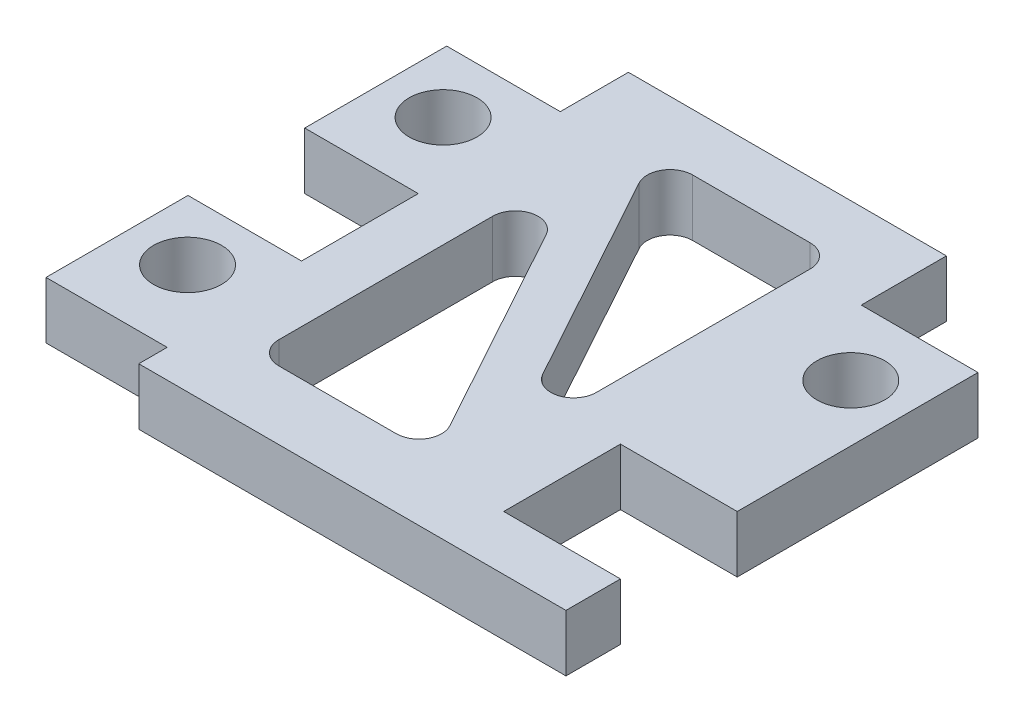
ISO-10303-21;
HEADER;
FILE_DESCRIPTION(('STEP AP214'),'2;1');
FILE_NAME('part.step','',(''),(''),'','','');
FILE_SCHEMA(('AUTOMOTIVE_DESIGN { 1 0 10303 214 1 1 1 1 }'));
ENDSEC;
DATA;
#1=APPLICATION_CONTEXT('core data for automotive mechanical design processes');
#2=APPLICATION_PROTOCOL_DEFINITION('international standard','automotive_design',2000,#1);
#3=PRODUCT_CONTEXT('',#1,'mechanical');
#4=PRODUCT('Part','Part','',(#3));
#5=PRODUCT_RELATED_PRODUCT_CATEGORY('part','',(#4));
#6=PRODUCT_DEFINITION_FORMATION('','',#4);
#7=PRODUCT_DEFINITION_CONTEXT('part definition',#1,'design');
#8=PRODUCT_DEFINITION('design','',#6,#7);
#9=PRODUCT_DEFINITION_SHAPE('','',#8);
#10=(LENGTH_UNIT() NAMED_UNIT(*) SI_UNIT(.MILLI.,.METRE.));
#11=(NAMED_UNIT(*) PLANE_ANGLE_UNIT() SI_UNIT($,.RADIAN.));
#12=(NAMED_UNIT(*) SI_UNIT($,.STERADIAN.) SOLID_ANGLE_UNIT());
#13=UNCERTAINTY_MEASURE_WITH_UNIT(LENGTH_MEASURE(1.E-05),#10,'distance_accuracy_value','');
#14=(GEOMETRIC_REPRESENTATION_CONTEXT(3) GLOBAL_UNCERTAINTY_ASSIGNED_CONTEXT((#13)) GLOBAL_UNIT_ASSIGNED_CONTEXT((#10,
#11,#12)) REPRESENTATION_CONTEXT('',''));
#15=CARTESIAN_POINT('',(0.,0.,0.));
#16=DIRECTION('',(0.,0.,1.));
#17=DIRECTION('',(1.,0.,0.));
#18=AXIS2_PLACEMENT_3D('',#15,#16,#17);
#19=CARTESIAN_POINT('',(-8.97889999999999,3.175,0.));
#20=DIRECTION('',(1.,0.,0.));
#21=DIRECTION('',(0.,0.,-1.));
#22=AXIS2_PLACEMENT_3D('',#19,#20,#21);
#23=PLANE('',#22);
#24=DIRECTION('',(0.,0.,1.));
#25=VECTOR('',#24,1.);
#26=CARTESIAN_POINT('',(-8.97889999999999,0.,0.));
#27=LINE('',#26,#25);
#28=CARTESIAN_POINT('',(-8.97889999999999,0.,-5.77937691821316));
#29=VERTEX_POINT('',#28);
#30=CARTESIAN_POINT('',(-8.97889999999999,0.,-4.19187691821315));
#31=VERTEX_POINT('',#30);
#32=EDGE_CURVE('E260',#29,#31,#27,.T.);
#33=ORIENTED_EDGE('',*,*,#32,.T.);
#34=DIRECTION('',(0.,-1.,0.));
#35=VECTOR('',#34,1.);
#36=CARTESIAN_POINT('',(-8.97889999999999,3.175,-4.19187691821315));
#37=LINE('',#36,#35);
#38=CARTESIAN_POINT('',(-8.97889999999999,3.175,-4.19187691821315));
#39=VERTEX_POINT('',#38);
#40=EDGE_CURVE('E241',#39,#31,#37,.T.);
#41=ORIENTED_EDGE('',*,*,#40,.F.);
#42=DIRECTION('',(0.,0.,1.));
#43=VECTOR('',#42,1.);
#44=CARTESIAN_POINT('',(-8.97889999999999,3.175,0.));
#45=LINE('',#44,#43);
#46=CARTESIAN_POINT('',(-8.97889999999999,3.175,-5.77937691821316));
#47=VERTEX_POINT('',#46);
#48=EDGE_CURVE('E248',#47,#39,#45,.T.);
#49=ORIENTED_EDGE('',*,*,#48,.F.);
#50=DIRECTION('',(0.,-1.,0.));
#51=VECTOR('',#50,1.);
#52=CARTESIAN_POINT('',(-8.97889999999999,3.175,-5.77937691821316));
#53=LINE('',#52,#51);
#54=EDGE_CURVE('E391',#47,#29,#53,.T.);
#55=ORIENTED_EDGE('',*,*,#54,.T.);
#56=EDGE_LOOP('',(#33,#41,#49,#55));
#57=FACE_BOUND('',#56,.T.);
#58=ADVANCED_FACE('F39',(#57),#23,.F.);
#59=CARTESIAN_POINT('',(0.,3.175,-4.19187691821315));
#60=DIRECTION('',(0.,0.,-1.));
#61=DIRECTION('',(-1.,0.,0.));
#62=AXIS2_PLACEMENT_3D('',#59,#60,#61);
#63=PLANE('',#62);
#64=DIRECTION('',(1.,0.,0.));
#65=VECTOR('',#64,1.);
#66=CARTESIAN_POINT('',(0.,0.,-4.19187691821315));
#67=LINE('',#66,#65);
#68=CARTESIAN_POINT('',(14.9043806406089,0.,-4.19187691821315));
#69=VERTEX_POINT('',#68);
#70=EDGE_CURVE('E407',#31,#69,#67,.T.);
#71=ORIENTED_EDGE('',*,*,#70,.T.);
#72=DIRECTION('',(0.,-1.,0.));
#73=VECTOR('',#72,1.);
#74=CARTESIAN_POINT('',(14.9043806406089,3.175,-4.19187691821315));
#75=LINE('',#74,#73);
#76=CARTESIAN_POINT('',(14.9043806406089,3.175,-4.19187691821315));
#77=VERTEX_POINT('',#76);
#78=EDGE_CURVE('E243',#77,#69,#75,.T.);
#79=ORIENTED_EDGE('',*,*,#78,.F.);
#80=DIRECTION('',(1.,0.,0.));
#81=VECTOR('',#80,1.);
#82=CARTESIAN_POINT('',(0.,3.175,-4.19187691821315));
#83=LINE('',#82,#81);
#84=EDGE_CURVE('E236',#39,#77,#83,.T.);
#85=ORIENTED_EDGE('',*,*,#84,.F.);
#86=ORIENTED_EDGE('',*,*,#40,.T.);
#87=EDGE_LOOP('',(#71,#79,#85,#86));
#88=FACE_BOUND('',#87,.T.);
#89=ADVANCED_FACE('F239',(#88),#63,.F.);
#90=CARTESIAN_POINT('',(14.9043806406089,3.175,0.));
#91=DIRECTION('',(1.,0.,0.));
#92=DIRECTION('',(0.,0.,-1.));
#93=AXIS2_PLACEMENT_3D('',#90,#91,#92);
#94=PLANE('',#93);
#95=DIRECTION('',(0.,0.,1.));
#96=VECTOR('',#95,1.);
#97=CARTESIAN_POINT('',(14.9043806406089,0.,0.));
#98=LINE('',#97,#96);
#99=CARTESIAN_POINT('',(14.9043806406089,0.,-7.23987691821315));
#100=VERTEX_POINT('',#99);
#101=EDGE_CURVE('E409',#100,#69,#98,.T.);
#102=ORIENTED_EDGE('',*,*,#101,.F.);
#103=DIRECTION('',(0.,-1.,0.));
#104=VECTOR('',#103,1.);
#105=CARTESIAN_POINT('',(14.9043806406089,3.175,-7.23987691821315));
#106=LINE('',#105,#104);
#107=CARTESIAN_POINT('',(14.9043806406089,3.175,-7.23987691821315));
#108=VERTEX_POINT('',#107);
#109=EDGE_CURVE('E265',#108,#100,#106,.T.);
#110=ORIENTED_EDGE('',*,*,#109,.F.);
#111=DIRECTION('',(0.,0.,1.));
#112=VECTOR('',#111,1.);
#113=CARTESIAN_POINT('',(14.9043806406089,3.175,0.));
#114=LINE('',#113,#112);
#115=EDGE_CURVE('E247',#108,#77,#114,.T.);
#116=ORIENTED_EDGE('',*,*,#115,.T.);
#117=ORIENTED_EDGE('',*,*,#78,.T.);
#118=EDGE_LOOP('',(#102,#110,#116,#117));
#119=FACE_BOUND('',#118,.T.);
#120=ADVANCED_FACE('F489',(#119),#94,.T.);
#121=CARTESIAN_POINT('',(0.,3.175,-7.23987691821315));
#122=DIRECTION('',(0.,0.,-1.));
#123=DIRECTION('',(-1.,0.,0.));
#124=AXIS2_PLACEMENT_3D('',#121,#122,#123);
#125=PLANE('',#124);
#126=DIRECTION('',(1.,0.,0.));
#127=VECTOR('',#126,1.);
#128=CARTESIAN_POINT('',(0.,0.,-7.23987691821315));
#129=LINE('',#128,#127);
#130=CARTESIAN_POINT('',(8.37658064060886,0.,-7.23987691821315));
#131=VERTEX_POINT('',#130);
#132=EDGE_CURVE('E412',#131,#100,#129,.T.);
#133=ORIENTED_EDGE('',*,*,#132,.F.);
#134=DIRECTION('',(0.,-1.,0.));
#135=VECTOR('',#134,1.);
#136=CARTESIAN_POINT('',(8.37658064060886,3.175,-7.23987691821315));
#137=LINE('',#136,#135);
#138=CARTESIAN_POINT('',(8.37658064060886,3.175,-7.23987691821315));
#139=VERTEX_POINT('',#138);
#140=EDGE_CURVE('E482',#139,#131,#137,.T.);
#141=ORIENTED_EDGE('',*,*,#140,.F.);
#142=DIRECTION('',(1.,0.,0.));
#143=VECTOR('',#142,1.);
#144=CARTESIAN_POINT('',(0.,3.175,-7.23987691821315));
#145=LINE('',#144,#143);
#146=EDGE_CURVE('E357',#139,#108,#145,.T.);
#147=ORIENTED_EDGE('',*,*,#146,.T.);
#148=ORIENTED_EDGE('',*,*,#109,.T.);
#149=EDGE_LOOP('',(#133,#141,#147,#148));
#150=FACE_BOUND('',#149,.T.);
#151=ADVANCED_FACE('F486',(#150),#125,.T.);
#152=CARTESIAN_POINT('',(8.37658064060886,3.175,0.));
#153=DIRECTION('',(-1.,0.,0.));
#154=DIRECTION('',(0.,0.,1.));
#155=AXIS2_PLACEMENT_3D('',#152,#153,#154);
#156=PLANE('',#155);
#157=DIRECTION('',(0.,0.,-1.));
#158=VECTOR('',#157,1.);
#159=CARTESIAN_POINT('',(8.37658064060886,0.,0.));
#160=LINE('',#159,#158);
#161=CARTESIAN_POINT('',(8.37658064060886,0.,-13.7676769182132));
#162=VERTEX_POINT('',#161);
#163=EDGE_CURVE('E415',#131,#162,#160,.T.);
#164=ORIENTED_EDGE('',*,*,#163,.T.);
#165=DIRECTION('',(0.,-1.,0.));
#166=VECTOR('',#165,1.);
#167=CARTESIAN_POINT('',(8.37658064060886,3.175,-13.7676769182132));
#168=LINE('',#167,#166);
#169=CARTESIAN_POINT('',(8.37658064060886,3.175,-13.7676769182132));
#170=VERTEX_POINT('',#169);
#171=EDGE_CURVE('E479',#170,#162,#168,.T.);
#172=ORIENTED_EDGE('',*,*,#171,.F.);
#173=DIRECTION('',(0.,0.,-1.));
#174=VECTOR('',#173,1.);
#175=CARTESIAN_POINT('',(8.37658064060886,3.175,0.));
#176=LINE('',#175,#174);
#177=EDGE_CURVE('E360',#139,#170,#176,.T.);
#178=ORIENTED_EDGE('',*,*,#177,.F.);
#179=ORIENTED_EDGE('',*,*,#140,.T.);
#180=EDGE_LOOP('',(#164,#172,#178,#179));
#181=FACE_BOUND('',#180,.T.);
#182=ADVANCED_FACE('F496',(#181),#156,.F.);
#183=CARTESIAN_POINT('',(0.,3.175,-13.7676769182132));
#184=DIRECTION('',(0.,0.,-1.));
#185=DIRECTION('',(-1.,0.,0.));
#186=AXIS2_PLACEMENT_3D('',#183,#184,#185);
#187=PLANE('',#186);
#188=DIRECTION('',(1.,0.,0.));
#189=VECTOR('',#188,1.);
#190=CARTESIAN_POINT('',(0.,0.,-13.7676769182132));
#191=LINE('',#190,#189);
#192=CARTESIAN_POINT('',(14.9043806406089,0.,-13.7676769182132));
#193=VERTEX_POINT('',#192);
#194=EDGE_CURVE('E417',#162,#193,#191,.T.);
#195=ORIENTED_EDGE('',*,*,#194,.T.);
#196=DIRECTION('',(0.,-1.,0.));
#197=VECTOR('',#196,1.);
#198=CARTESIAN_POINT('',(14.9043806406089,3.175,-13.7676769182132));
#199=LINE('',#198,#197);
#200=CARTESIAN_POINT('',(14.9043806406089,3.175,-13.7676769182132));
#201=VERTEX_POINT('',#200);
#202=EDGE_CURVE('E476',#201,#193,#199,.T.);
#203=ORIENTED_EDGE('',*,*,#202,.F.);
#204=DIRECTION('',(1.,0.,0.));
#205=VECTOR('',#204,1.);
#206=CARTESIAN_POINT('',(0.,3.175,-13.7676769182132));
#207=LINE('',#206,#205);
#208=EDGE_CURVE('E362',#170,#201,#207,.T.);
#209=ORIENTED_EDGE('',*,*,#208,.F.);
#210=ORIENTED_EDGE('',*,*,#171,.T.);
#211=EDGE_LOOP('',(#195,#203,#209,#210));
#212=FACE_BOUND('',#211,.T.);
#213=ADVANCED_FACE('F500',(#212),#187,.F.);
#214=CARTESIAN_POINT('',(14.9043806406089,3.175,0.));
#215=DIRECTION('',(-1.,0.,0.));
#216=DIRECTION('',(0.,0.,1.));
#217=AXIS2_PLACEMENT_3D('',#214,#215,#216);
#218=PLANE('',#217);
#219=DIRECTION('',(0.,0.,-1.));
#220=VECTOR('',#219,1.);
#221=CARTESIAN_POINT('',(14.9043806406089,0.,0.));
#222=LINE('',#221,#220);
#223=CARTESIAN_POINT('',(14.9043806406089,0.,-27.2296769182132));
#224=VERTEX_POINT('',#223);
#225=EDGE_CURVE('E419',#193,#224,#222,.T.);
#226=ORIENTED_EDGE('',*,*,#225,.T.);
#227=DIRECTION('',(0.,-1.,0.));
#228=VECTOR('',#227,1.);
#229=CARTESIAN_POINT('',(14.9043806406089,3.175,-27.2296769182132));
#230=LINE('',#229,#228);
#231=CARTESIAN_POINT('',(14.9043806406089,3.175,-27.2296769182132));
#232=VERTEX_POINT('',#231);
#233=EDGE_CURVE('E474',#232,#224,#230,.T.);
#234=ORIENTED_EDGE('',*,*,#233,.F.);
#235=DIRECTION('',(0.,0.,-1.));
#236=VECTOR('',#235,1.);
#237=CARTESIAN_POINT('',(14.9043806406089,3.175,0.));
#238=LINE('',#237,#236);
#239=EDGE_CURVE('E364',#201,#232,#238,.T.);
#240=ORIENTED_EDGE('',*,*,#239,.F.);
#241=ORIENTED_EDGE('',*,*,#202,.T.);
#242=EDGE_LOOP('',(#226,#234,#240,#241));
#243=FACE_BOUND('',#242,.T.);
#244=ADVANCED_FACE('F506',(#243),#218,.F.);
#245=CARTESIAN_POINT('',(0.,3.175,-27.2296769182132));
#246=DIRECTION('',(0.,0.,-1.));
#247=DIRECTION('',(-1.,0.,0.));
#248=AXIS2_PLACEMENT_3D('',#245,#246,#247);
#249=PLANE('',#248);
#250=DIRECTION('',(1.,0.,0.));
#251=VECTOR('',#250,1.);
#252=CARTESIAN_POINT('',(0.,0.,-27.2296769182132));
#253=LINE('',#252,#251);
#254=CARTESIAN_POINT('',(8.37658064060886,0.,-27.2296769182132));
#255=VERTEX_POINT('',#254);
#256=EDGE_CURVE('E422',#255,#224,#253,.T.);
#257=ORIENTED_EDGE('',*,*,#256,.F.);
#258=DIRECTION('',(0.,-1.,0.));
#259=VECTOR('',#258,1.);
#260=CARTESIAN_POINT('',(8.37658064060886,3.175,-27.2296769182132));
#261=LINE('',#260,#259);
#262=CARTESIAN_POINT('',(8.37658064060886,3.175,-27.2296769182132));
#263=VERTEX_POINT('',#262);
#264=EDGE_CURVE('E472',#263,#255,#261,.T.);
#265=ORIENTED_EDGE('',*,*,#264,.F.);
#266=DIRECTION('',(1.,0.,0.));
#267=VECTOR('',#266,1.);
#268=CARTESIAN_POINT('',(0.,3.175,-27.2296769182132));
#269=LINE('',#268,#267);
#270=EDGE_CURVE('E366',#263,#232,#269,.T.);
#271=ORIENTED_EDGE('',*,*,#270,.T.);
#272=ORIENTED_EDGE('',*,*,#233,.T.);
#273=EDGE_LOOP('',(#257,#265,#271,#272));
#274=FACE_BOUND('',#273,.T.);
#275=ADVANCED_FACE('F509',(#274),#249,.T.);
#276=CARTESIAN_POINT('',(8.37658064060886,3.175,0.));
#277=DIRECTION('',(-1.,0.,0.));
#278=DIRECTION('',(0.,0.,1.));
#279=AXIS2_PLACEMENT_3D('',#276,#277,#278);
#280=PLANE('',#279);
#281=DIRECTION('',(0.,0.,-1.));
#282=VECTOR('',#281,1.);
#283=CARTESIAN_POINT('',(8.37658064060886,0.,0.));
#284=LINE('',#283,#282);
#285=CARTESIAN_POINT('',(8.37658064060886,0.,-31.9921769182131));
#286=VERTEX_POINT('',#285);
#287=EDGE_CURVE('E425',#255,#286,#284,.T.);
#288=ORIENTED_EDGE('',*,*,#287,.T.);
#289=DIRECTION('',(0.,-1.,0.));
#290=VECTOR('',#289,1.);
#291=CARTESIAN_POINT('',(8.37658064060886,3.175,-31.9921769182131));
#292=LINE('',#291,#290);
#293=CARTESIAN_POINT('',(8.37658064060886,3.175,-31.9921769182131));
#294=VERTEX_POINT('',#293);
#295=EDGE_CURVE('E469',#294,#286,#292,.T.);
#296=ORIENTED_EDGE('',*,*,#295,.F.);
#297=DIRECTION('',(0.,0.,-1.));
#298=VECTOR('',#297,1.);
#299=CARTESIAN_POINT('',(8.37658064060886,3.175,0.));
#300=LINE('',#299,#298);
#301=EDGE_CURVE('E369',#263,#294,#300,.T.);
#302=ORIENTED_EDGE('',*,*,#301,.F.);
#303=ORIENTED_EDGE('',*,*,#264,.T.);
#304=EDGE_LOOP('',(#288,#296,#302,#303));
#305=FACE_BOUND('',#304,.T.);
#306=ADVANCED_FACE('F514',(#305),#280,.F.);
#307=CARTESIAN_POINT('',(0.,3.175,-31.9921769182131));
#308=DIRECTION('',(0.,0.,1.));
#309=DIRECTION('',(1.,0.,0.));
#310=AXIS2_PLACEMENT_3D('',#307,#308,#309);
#311=PLANE('',#310);
#312=DIRECTION('',(-1.,0.,0.));
#313=VECTOR('',#312,1.);
#314=CARTESIAN_POINT('',(0.,0.,-31.9921769182131));
#315=LINE('',#314,#313);
#316=CARTESIAN_POINT('',(-9.40341935939114,0.,-31.9921769182132));
#317=VERTEX_POINT('',#316);
#318=EDGE_CURVE('E427',#286,#317,#315,.T.);
#319=ORIENTED_EDGE('',*,*,#318,.T.);
#320=DIRECTION('',(0.,-1.,0.));
#321=VECTOR('',#320,1.);
#322=CARTESIAN_POINT('',(-9.40341935939114,3.175,-31.9921769182132));
#323=LINE('',#322,#321);
#324=CARTESIAN_POINT('',(-9.40341935939114,3.175,-31.9921769182132));
#325=VERTEX_POINT('',#324);
#326=EDGE_CURVE('E467',#325,#317,#323,.T.);
#327=ORIENTED_EDGE('',*,*,#326,.F.);
#328=DIRECTION('',(-1.,0.,0.));
#329=VECTOR('',#328,1.);
#330=CARTESIAN_POINT('',(0.,3.175,-31.9921769182131));
#331=LINE('',#330,#329);
#332=EDGE_CURVE('E371',#294,#325,#331,.T.);
#333=ORIENTED_EDGE('',*,*,#332,.F.);
#334=ORIENTED_EDGE('',*,*,#295,.T.);
#335=EDGE_LOOP('',(#319,#327,#333,#334));
#336=FACE_BOUND('',#335,.T.);
#337=ADVANCED_FACE('F519',(#336),#311,.F.);
#338=CARTESIAN_POINT('',(-9.40341935939112,3.175,0.));
#339=DIRECTION('',(-1.,0.,0.));
#340=DIRECTION('',(0.,0.,1.));
#341=AXIS2_PLACEMENT_3D('',#338,#339,#340);
#342=PLANE('',#341);
#343=DIRECTION('',(0.,0.,-1.));
#344=VECTOR('',#343,1.);
#345=CARTESIAN_POINT('',(-9.40341935939112,0.,0.));
#346=LINE('',#345,#344);
#347=CARTESIAN_POINT('',(-9.40341935939113,0.,-28.1821769182132));
#348=VERTEX_POINT('',#347);
#349=EDGE_CURVE('E430',#348,#317,#346,.T.);
#350=ORIENTED_EDGE('',*,*,#349,.F.);
#351=DIRECTION('',(0.,-1.,0.));
#352=VECTOR('',#351,1.);
#353=CARTESIAN_POINT('',(-9.40341935939113,3.175,-28.1821769182132));
#354=LINE('',#353,#352);
#355=CARTESIAN_POINT('',(-9.40341935939113,3.175,-28.1821769182132));
#356=VERTEX_POINT('',#355);
#357=EDGE_CURVE('E465',#356,#348,#354,.T.);
#358=ORIENTED_EDGE('',*,*,#357,.F.);
#359=DIRECTION('',(0.,0.,-1.));
#360=VECTOR('',#359,1.);
#361=CARTESIAN_POINT('',(-9.40341935939112,3.175,0.));
#362=LINE('',#361,#360);
#363=EDGE_CURVE('E373',#356,#325,#362,.T.);
#364=ORIENTED_EDGE('',*,*,#363,.T.);
#365=ORIENTED_EDGE('',*,*,#326,.T.);
#366=EDGE_LOOP('',(#350,#358,#364,#365));
#367=FACE_BOUND('',#366,.T.);
#368=ADVANCED_FACE('F523',(#367),#342,.T.);
#369=CARTESIAN_POINT('',(0.,3.175,-28.1821769182132));
#370=DIRECTION('',(0.,0.,1.));
#371=DIRECTION('',(1.,0.,0.));
#372=AXIS2_PLACEMENT_3D('',#369,#370,#371);
#373=PLANE('',#372);
#374=DIRECTION('',(-1.,0.,0.));
#375=VECTOR('',#374,1.);
#376=CARTESIAN_POINT('',(0.,0.,-28.1821769182132));
#377=LINE('',#376,#375);
#378=CARTESIAN_POINT('',(-15.7534193593911,0.,-28.1821769182132));
#379=VERTEX_POINT('',#378);
#380=EDGE_CURVE('E433',#348,#379,#377,.T.);
#381=ORIENTED_EDGE('',*,*,#380,.T.);
#382=DIRECTION('',(0.,-1.,0.));
#383=VECTOR('',#382,1.);
#384=CARTESIAN_POINT('',(-15.7534193593911,3.175,-28.1821769182132));
#385=LINE('',#384,#383);
#386=CARTESIAN_POINT('',(-15.7534193593911,3.175,-28.1821769182132));
#387=VERTEX_POINT('',#386);
#388=EDGE_CURVE('E463',#387,#379,#385,.T.);
#389=ORIENTED_EDGE('',*,*,#388,.F.);
#390=DIRECTION('',(-1.,0.,0.));
#391=VECTOR('',#390,1.);
#392=CARTESIAN_POINT('',(0.,3.175,-28.1821769182132));
#393=LINE('',#392,#391);
#394=EDGE_CURVE('E376',#356,#387,#393,.T.);
#395=ORIENTED_EDGE('',*,*,#394,.F.);
#396=ORIENTED_EDGE('',*,*,#357,.T.);
#397=EDGE_LOOP('',(#381,#389,#395,#396));
#398=FACE_BOUND('',#397,.T.);
#399=ADVANCED_FACE('F528',(#398),#373,.F.);
#400=CARTESIAN_POINT('',(-15.7534193593911,3.175,0.));
#401=DIRECTION('',(-1.,0.,0.));
#402=DIRECTION('',(0.,0.,1.));
#403=AXIS2_PLACEMENT_3D('',#400,#401,#402);
#404=PLANE('',#403);
#405=DIRECTION('',(0.,0.,-1.));
#406=VECTOR('',#405,1.);
#407=CARTESIAN_POINT('',(-15.7534193593911,0.,0.));
#408=LINE('',#407,#406);
#409=CARTESIAN_POINT('',(-15.7534193593911,0.,-20.2446769182132));
#410=VERTEX_POINT('',#409);
#411=EDGE_CURVE('E436',#410,#379,#408,.T.);
#412=ORIENTED_EDGE('',*,*,#411,.F.);
#413=DIRECTION('',(0.,-1.,0.));
#414=VECTOR('',#413,1.);
#415=CARTESIAN_POINT('',(-15.7534193593911,3.175,-20.2446769182132));
#416=LINE('',#415,#414);
#417=CARTESIAN_POINT('',(-15.7534193593911,3.175,-20.2446769182132));
#418=VERTEX_POINT('',#417);
#419=EDGE_CURVE('E461',#418,#410,#416,.T.);
#420=ORIENTED_EDGE('',*,*,#419,.F.);
#421=DIRECTION('',(0.,0.,-1.));
#422=VECTOR('',#421,1.);
#423=CARTESIAN_POINT('',(-15.7534193593911,3.175,0.));
#424=LINE('',#423,#422);
#425=EDGE_CURVE('E378',#418,#387,#424,.T.);
#426=ORIENTED_EDGE('',*,*,#425,.T.);
#427=ORIENTED_EDGE('',*,*,#388,.T.);
#428=EDGE_LOOP('',(#412,#420,#426,#427));
#429=FACE_BOUND('',#428,.T.);
#430=ADVANCED_FACE('F553',(#429),#404,.T.);
#431=CARTESIAN_POINT('',(0.,3.175,-20.2446769182132));
#432=DIRECTION('',(0.,0.,1.));
#433=DIRECTION('',(1.,0.,0.));
#434=AXIS2_PLACEMENT_3D('',#431,#432,#433);
#435=PLANE('',#434);
#436=DIRECTION('',(-1.,0.,0.));
#437=VECTOR('',#436,1.);
#438=CARTESIAN_POINT('',(0.,0.,-20.2446769182132));
#439=LINE('',#438,#437);
#440=CARTESIAN_POINT('',(-9.40341935939113,0.,-20.2446769182132));
#441=VERTEX_POINT('',#440);
#442=EDGE_CURVE('E439',#441,#410,#439,.T.);
#443=ORIENTED_EDGE('',*,*,#442,.F.);
#444=DIRECTION('',(0.,-1.,0.));
#445=VECTOR('',#444,1.);
#446=CARTESIAN_POINT('',(-9.40341935939113,3.175,-20.2446769182132));
#447=LINE('',#446,#445);
#448=CARTESIAN_POINT('',(-9.40341935939113,3.175,-20.2446769182132));
#449=VERTEX_POINT('',#448);
#450=EDGE_CURVE('E459',#449,#441,#447,.T.);
#451=ORIENTED_EDGE('',*,*,#450,.F.);
#452=DIRECTION('',(-1.,0.,0.));
#453=VECTOR('',#452,1.);
#454=CARTESIAN_POINT('',(0.,3.175,-20.2446769182132));
#455=LINE('',#454,#453);
#456=EDGE_CURVE('E381',#449,#418,#455,.T.);
#457=ORIENTED_EDGE('',*,*,#456,.T.);
#458=ORIENTED_EDGE('',*,*,#419,.T.);
#459=EDGE_LOOP('',(#443,#451,#457,#458));
#460=FACE_BOUND('',#459,.T.);
#461=ADVANCED_FACE('F535',(#460),#435,.T.);
#462=CARTESIAN_POINT('',(-9.40341935939113,3.175,0.));
#463=DIRECTION('',(-1.,0.,0.));
#464=DIRECTION('',(0.,0.,1.));
#465=AXIS2_PLACEMENT_3D('',#462,#463,#464);
#466=PLANE('',#465);
#467=DIRECTION('',(0.,0.,-1.));
#468=VECTOR('',#467,1.);
#469=CARTESIAN_POINT('',(-9.40341935939113,0.,0.));
#470=LINE('',#469,#468);
#471=CARTESIAN_POINT('',(-9.40341935939113,0.,-13.7168769182132));
#472=VERTEX_POINT('',#471);
#473=EDGE_CURVE('E442',#472,#441,#470,.T.);
#474=ORIENTED_EDGE('',*,*,#473,.F.);
#475=DIRECTION('',(0.,-1.,0.));
#476=VECTOR('',#475,1.);
#477=CARTESIAN_POINT('',(-9.40341935939113,3.175,-13.7168769182132));
#478=LINE('',#477,#476);
#479=CARTESIAN_POINT('',(-9.40341935939113,3.175,-13.7168769182132));
#480=VERTEX_POINT('',#479);
#481=EDGE_CURVE('E457',#480,#472,#478,.T.);
#482=ORIENTED_EDGE('',*,*,#481,.F.);
#483=DIRECTION('',(0.,0.,-1.));
#484=VECTOR('',#483,1.);
#485=CARTESIAN_POINT('',(-9.40341935939113,3.175,0.));
#486=LINE('',#485,#484);
#487=EDGE_CURVE('E384',#480,#449,#486,.T.);
#488=ORIENTED_EDGE('',*,*,#487,.T.);
#489=ORIENTED_EDGE('',*,*,#450,.T.);
#490=EDGE_LOOP('',(#474,#482,#488,#489));
#491=FACE_BOUND('',#490,.T.);
#492=ADVANCED_FACE('F539',(#491),#466,.T.);
#493=CARTESIAN_POINT('',(0.,3.175,-13.7168769182132));
#494=DIRECTION('',(0.,0.,1.));
#495=DIRECTION('',(1.,0.,0.));
#496=AXIS2_PLACEMENT_3D('',#493,#494,#495);
#497=PLANE('',#496);
#498=DIRECTION('',(-1.,0.,0.));
#499=VECTOR('',#498,1.);
#500=CARTESIAN_POINT('',(0.,0.,-13.7168769182132));
#501=LINE('',#500,#499);
#502=CARTESIAN_POINT('',(-15.7534193593911,0.,-13.7168769182132));
#503=VERTEX_POINT('',#502);
#504=EDGE_CURVE('E445',#472,#503,#501,.T.);
#505=ORIENTED_EDGE('',*,*,#504,.T.);
#506=DIRECTION('',(0.,-1.,0.));
#507=VECTOR('',#506,1.);
#508=CARTESIAN_POINT('',(-15.7534193593911,3.175,-13.7168769182132));
#509=LINE('',#508,#507);
#510=CARTESIAN_POINT('',(-15.7534193593911,3.175,-13.7168769182132));
#511=VERTEX_POINT('',#510);
#512=EDGE_CURVE('E454',#511,#503,#509,.T.);
#513=ORIENTED_EDGE('',*,*,#512,.F.);
#514=DIRECTION('',(-1.,0.,0.));
#515=VECTOR('',#514,1.);
#516=CARTESIAN_POINT('',(0.,3.175,-13.7168769182132));
#517=LINE('',#516,#515);
#518=EDGE_CURVE('E387',#480,#511,#517,.T.);
#519=ORIENTED_EDGE('',*,*,#518,.F.);
#520=ORIENTED_EDGE('',*,*,#481,.T.);
#521=EDGE_LOOP('',(#505,#513,#519,#520));
#522=FACE_BOUND('',#521,.T.);
#523=ADVANCED_FACE('F545',(#522),#497,.F.);
#524=CARTESIAN_POINT('',(-15.7534193593911,3.175,0.));
#525=DIRECTION('',(1.,0.,0.));
#526=DIRECTION('',(0.,0.,-1.));
#527=AXIS2_PLACEMENT_3D('',#524,#525,#526);
#528=PLANE('',#527);
#529=DIRECTION('',(0.,0.,1.));
#530=VECTOR('',#529,1.);
#531=CARTESIAN_POINT('',(-15.7534193593911,0.,0.));
#532=LINE('',#531,#530);
#533=CARTESIAN_POINT('',(-15.7534193593911,0.,-5.77937691821316));
#534=VERTEX_POINT('',#533);
#535=EDGE_CURVE('E447',#503,#534,#532,.T.);
#536=ORIENTED_EDGE('',*,*,#535,.T.);
#537=DIRECTION('',(0.,-1.,0.));
#538=VECTOR('',#537,1.);
#539=CARTESIAN_POINT('',(-15.7534193593911,3.175,-5.77937691821316));
#540=LINE('',#539,#538);
#541=CARTESIAN_POINT('',(-15.7534193593911,3.175,-5.77937691821316));
#542=VERTEX_POINT('',#541);
#543=EDGE_CURVE('E451',#542,#534,#540,.T.);
#544=ORIENTED_EDGE('',*,*,#543,.F.);
#545=DIRECTION('',(0.,0.,1.));
#546=VECTOR('',#545,1.);
#547=CARTESIAN_POINT('',(-15.7534193593911,3.175,0.));
#548=LINE('',#547,#546);
#549=EDGE_CURVE('E389',#511,#542,#548,.T.);
#550=ORIENTED_EDGE('',*,*,#549,.F.);
#551=ORIENTED_EDGE('',*,*,#512,.T.);
#552=EDGE_LOOP('',(#536,#544,#550,#551));
#553=FACE_BOUND('',#552,.T.);
#554=ADVANCED_FACE('F549',(#553),#528,.F.);
#555=CARTESIAN_POINT('',(6.25930659999933,3.175,-3.43708111043283));
#556=DIRECTION('',(0.876543158154141,0.,-0.481323271713684));
#557=DIRECTION('',(-0.481323271713684,0.,-0.876543158154141));
#558=AXIS2_PLACEMENT_3D('',#555,#556,#557);
#559=PLANE('',#558);
#560=DIRECTION('',(0.481323271713684,0.,0.876543158154141));
#561=VECTOR('',#560,1.);
#562=CARTESIAN_POINT('',(6.25930659999933,0.,-3.43708111043283));
#563=LINE('',#562,#561);
#564=CARTESIAN_POINT('',(-3.84520954853538,0.,-21.838527740931));
#565=VERTEX_POINT('',#564);
#566=CARTESIAN_POINT('',(2.71966735254903,0.,-9.88315747328955));
#567=VERTEX_POINT('',#566);
#568=EDGE_CURVE('E397',#565,#567,#563,.T.);
#569=ORIENTED_EDGE('',*,*,#568,.T.);
#570=DIRECTION('',(0.,-1.,0.));
#571=VECTOR('',#570,1.);
#572=CARTESIAN_POINT('',(2.71966735254903,3.175,-9.88315747328955));
#573=LINE('',#572,#571);
#574=CARTESIAN_POINT('',(2.71966735254903,3.175,-9.88315747328955));
#575=VERTEX_POINT('',#574);
#576=EDGE_CURVE('E279',#567,#575,#573,.F.);
#577=ORIENTED_EDGE('',*,*,#576,.T.);
#578=DIRECTION('',(0.481323271713684,0.,0.876543158154141));
#579=VECTOR('',#578,1.);
#580=CARTESIAN_POINT('',(6.25930659999933,3.175,-3.43708111043283));
#581=LINE('',#580,#579);
#582=CARTESIAN_POINT('',(-3.84520954853538,3.175,-21.838527740931));
#583=VERTEX_POINT('',#582);
#584=EDGE_CURVE('E343',#583,#575,#581,.T.);
#585=ORIENTED_EDGE('',*,*,#584,.F.);
#586=DIRECTION('',(0.,-1.,0.));
#587=VECTOR('',#586,1.);
#588=CARTESIAN_POINT('',(-3.84520954853537,3.175,-21.838527740931));
#589=LINE('',#588,#587);
#590=EDGE_CURVE('E276',#583,#565,#589,.T.);
#591=ORIENTED_EDGE('',*,*,#590,.T.);
#592=EDGE_LOOP('',(#569,#577,#585,#591));
#593=FACE_BOUND('',#592,.T.);
#594=ADVANCED_FACE('F578',(#593),#559,.F.);
#595=CARTESIAN_POINT('',(0.,3.175,-8.00187691821317));
#596=DIRECTION('',(0.,0.,-1.));
#597=DIRECTION('',(-1.,0.,0.));
#598=AXIS2_PLACEMENT_3D('',#595,#596,#597);
#599=PLANE('',#598);
#600=DIRECTION('',(1.,0.,0.));
#601=VECTOR('',#600,1.);
#602=CARTESIAN_POINT('',(0.,3.175,-8.00187691821317));
#603=LINE('',#602,#601);
#604=CARTESIAN_POINT('',(-4.95841935939113,3.175,-8.00187691821317));
#605=VERTEX_POINT('',#604);
#606=CARTESIAN_POINT('',(1.60645754169327,3.175,-8.00187691821317));
#607=VERTEX_POINT('',#606);
#608=EDGE_CURVE('E351',#605,#607,#603,.T.);
#609=ORIENTED_EDGE('',*,*,#608,.T.);
#610=DIRECTION('',(0.,-1.,0.));
#611=VECTOR('',#610,1.);
#612=CARTESIAN_POINT('',(1.60645754169327,3.175,-8.00187691821317));
#613=LINE('',#612,#611);
#614=CARTESIAN_POINT('',(1.60645754169327,0.,-8.00187691821317));
#615=VERTEX_POINT('',#614);
#616=EDGE_CURVE('E263',#607,#615,#613,.T.);
#617=ORIENTED_EDGE('',*,*,#616,.T.);
#618=DIRECTION('',(1.,0.,0.));
#619=VECTOR('',#618,1.);
#620=CARTESIAN_POINT('',(0.,0.,-8.00187691821317));
#621=LINE('',#620,#619);
#622=CARTESIAN_POINT('',(-4.95841935939113,0.,-8.00187691821317));
#623=VERTEX_POINT('',#622);
#624=EDGE_CURVE('E400',#623,#615,#621,.T.);
#625=ORIENTED_EDGE('',*,*,#624,.F.);
#626=DIRECTION('',(0.,-1.,0.));
#627=VECTOR('',#626,1.);
#628=CARTESIAN_POINT('',(-4.95841935939113,3.175,-8.00187691821317));
#629=LINE('',#628,#627);
#630=EDGE_CURVE('E261',#623,#605,#629,.F.);
#631=ORIENTED_EDGE('',*,*,#630,.T.);
#632=EDGE_LOOP('',(#609,#617,#625,#631));
#633=FACE_BOUND('',#632,.T.);
#634=ADVANCED_FACE('F575',(#633),#599,.T.);
#635=CARTESIAN_POINT('',(8.48572622171085,3.175,-4.65964222058558));
#636=DIRECTION('',(0.876543158154141,0.,-0.481323271713683));
#637=DIRECTION('',(-0.481323271713683,0.,-0.876543158154141));
#638=AXIS2_PLACEMENT_3D('',#635,#636,#637);
#639=PLANE('',#638);
#640=DIRECTION('',(0.481323271713684,0.,0.876543158154141));
#641=VECTOR('',#640,1.);
#642=CARTESIAN_POINT('',(8.48572622171085,3.175,-4.65964222058558));
#643=LINE('',#642,#641);
#644=CARTESIAN_POINT('',(-3.7465060713313,3.175,-26.9358963631368));
#645=VERTEX_POINT('',#644);
#646=CARTESIAN_POINT('',(2.8183708297531,3.175,-14.9805260954953));
#647=VERTEX_POINT('',#646);
#648=EDGE_CURVE('E340',#645,#647,#643,.T.);
#649=ORIENTED_EDGE('',*,*,#648,.T.);
#650=DIRECTION('',(0.,-1.,0.));
#651=VECTOR('',#650,1.);
#652=CARTESIAN_POINT('',(2.8183708297531,3.175,-14.9805260954953));
#653=LINE('',#652,#651);
#654=CARTESIAN_POINT('',(2.8183708297531,0.,-14.9805260954953));
#655=VERTEX_POINT('',#654);
#656=EDGE_CURVE('E288',#647,#655,#653,.T.);
#657=ORIENTED_EDGE('',*,*,#656,.T.);
#658=DIRECTION('',(0.481323271713684,0.,0.876543158154141));
#659=VECTOR('',#658,1.);
#660=CARTESIAN_POINT('',(8.48572622171085,0.,-4.65964222058558));
#661=LINE('',#660,#659);
#662=CARTESIAN_POINT('',(-3.7465060713313,0.,-26.9358963631368));
#663=VERTEX_POINT('',#662);
#664=EDGE_CURVE('E325',#663,#655,#661,.T.);
#665=ORIENTED_EDGE('',*,*,#664,.F.);
#666=DIRECTION('',(0.,-1.,0.));
#667=VECTOR('',#666,1.);
#668=CARTESIAN_POINT('',(-3.7465060713313,3.175,-26.9358963631368));
#669=LINE('',#668,#667);
#670=EDGE_CURVE('E286',#663,#645,#669,.F.);
#671=ORIENTED_EDGE('',*,*,#670,.T.);
#672=EDGE_LOOP('',(#649,#657,#665,#671));
#673=FACE_BOUND('',#672,.T.);
#674=ADVANCED_FACE('F332',(#673),#639,.T.);
#675=CARTESIAN_POINT('',(0.,3.175,-28.8171769182131));
#676=DIRECTION('',(0.,0.,-1.));
#677=DIRECTION('',(-1.,0.,0.));
#678=AXIS2_PLACEMENT_3D('',#675,#676,#677);
#679=PLANE('',#678);
#680=DIRECTION('',(1.,0.,0.));
#681=VECTOR('',#680,1.);
#682=CARTESIAN_POINT('',(0.,0.,-28.8171769182131));
#683=LINE('',#682,#681);
#684=CARTESIAN_POINT('',(-2.63329626047554,0.,-28.8171769182131));
#685=VERTEX_POINT('',#684);
#686=CARTESIAN_POINT('',(3.93158064060886,0.,-28.8171769182131));
#687=VERTEX_POINT('',#686);
#688=EDGE_CURVE('E326',#685,#687,#683,.T.);
#689=ORIENTED_EDGE('',*,*,#688,.T.);
#690=DIRECTION('',(0.,-1.,0.));
#691=VECTOR('',#690,1.);
#692=CARTESIAN_POINT('',(3.93158064060886,3.175,-28.8171769182131));
#693=LINE('',#692,#691);
#694=CARTESIAN_POINT('',(3.93158064060886,3.175,-28.8171769182131));
#695=VERTEX_POINT('',#694);
#696=EDGE_CURVE('E54',#687,#695,#693,.F.);
#697=ORIENTED_EDGE('',*,*,#696,.T.);
#698=DIRECTION('',(1.,0.,0.));
#699=VECTOR('',#698,1.);
#700=CARTESIAN_POINT('',(0.,3.175,-28.8171769182131));
#701=LINE('',#700,#699);
#702=CARTESIAN_POINT('',(-2.63329626047554,3.175,-28.8171769182131));
#703=VERTEX_POINT('',#702);
#704=EDGE_CURVE('E337',#703,#695,#701,.T.);
#705=ORIENTED_EDGE('',*,*,#704,.F.);
#706=DIRECTION('',(0.,-1.,0.));
#707=VECTOR('',#706,1.);
#708=CARTESIAN_POINT('',(-2.63329626047554,3.175,-28.8171769182131));
#709=LINE('',#708,#707);
#710=EDGE_CURVE('E296',#703,#685,#709,.T.);
#711=ORIENTED_EDGE('',*,*,#710,.T.);
#712=EDGE_LOOP('',(#689,#697,#705,#711));
#713=FACE_BOUND('',#712,.T.);
#714=ADVANCED_FACE('F336',(#713),#679,.F.);
#715=CARTESIAN_POINT('',(-6.22841935939113,3.175,0.));
#716=DIRECTION('',(1.,0.,0.));
#717=DIRECTION('',(0.,0.,-1.));
#718=AXIS2_PLACEMENT_3D('',#715,#716,#717);
#719=PLANE('',#718);
#720=DIRECTION('',(0.,0.,1.));
#721=VECTOR('',#720,1.);
#722=CARTESIAN_POINT('',(-6.22841935939113,0.,0.));
#723=LINE('',#722,#721);
#724=CARTESIAN_POINT('',(-6.22841935939113,0.,-21.2272471858546));
#725=VERTEX_POINT('',#724);
#726=CARTESIAN_POINT('',(-6.22841935939113,0.,-9.27187691821317));
#727=VERTEX_POINT('',#726);
#728=EDGE_CURVE('E403',#725,#727,#723,.T.);
#729=ORIENTED_EDGE('',*,*,#728,.F.);
#730=DIRECTION('',(0.,-1.,0.));
#731=VECTOR('',#730,1.);
#732=CARTESIAN_POINT('',(-6.22841935939113,3.175,-21.2272471858546));
#733=LINE('',#732,#731);
#734=CARTESIAN_POINT('',(-6.22841935939113,3.175,-21.2272471858546));
#735=VERTEX_POINT('',#734);
#736=EDGE_CURVE('E284',#725,#735,#733,.F.);
#737=ORIENTED_EDGE('',*,*,#736,.T.);
#738=DIRECTION('',(0.,0.,1.));
#739=VECTOR('',#738,1.);
#740=CARTESIAN_POINT('',(-6.22841935939113,3.175,0.));
#741=LINE('',#740,#739);
#742=CARTESIAN_POINT('',(-6.22841935939113,3.175,-9.27187691821317));
#743=VERTEX_POINT('',#742);
#744=EDGE_CURVE('E257',#735,#743,#741,.T.);
#745=ORIENTED_EDGE('',*,*,#744,.T.);
#746=DIRECTION('',(0.,-1.,0.));
#747=VECTOR('',#746,1.);
#748=CARTESIAN_POINT('',(-6.22841935939113,0.,-9.27187691821317));
#749=LINE('',#748,#747);
#750=EDGE_CURVE('E281',#743,#727,#749,.T.);
#751=ORIENTED_EDGE('',*,*,#750,.T.);
#752=EDGE_LOOP('',(#729,#737,#745,#751));
#753=FACE_BOUND('',#752,.T.);
#754=ADVANCED_FACE('F570',(#753),#719,.T.);
#755=CARTESIAN_POINT('',(5.20158064060887,3.175,0.));
#756=DIRECTION('',(1.,0.,0.));
#757=DIRECTION('',(0.,0.,-1.));
#758=AXIS2_PLACEMENT_3D('',#755,#756,#757);
#759=PLANE('',#758);
#760=DIRECTION('',(0.,0.,1.));
#761=VECTOR('',#760,1.);
#762=CARTESIAN_POINT('',(5.20158064060887,0.,0.));
#763=LINE('',#762,#761);
#764=CARTESIAN_POINT('',(5.20158064060886,0.,-27.5471769182132));
#765=VERTEX_POINT('',#764);
#766=CARTESIAN_POINT('',(5.20158064060886,0.,-15.5918066505717));
#767=VERTEX_POINT('',#766);
#768=EDGE_CURVE('E394',#765,#767,#763,.T.);
#769=ORIENTED_EDGE('',*,*,#768,.T.);
#770=DIRECTION('',(0.,-1.,0.));
#771=VECTOR('',#770,1.);
#772=CARTESIAN_POINT('',(5.20158064060886,3.175,-15.5918066505717));
#773=LINE('',#772,#771);
#774=CARTESIAN_POINT('',(5.20158064060886,3.175,-15.5918066505717));
#775=VERTEX_POINT('',#774);
#776=EDGE_CURVE('E294',#767,#775,#773,.F.);
#777=ORIENTED_EDGE('',*,*,#776,.T.);
#778=DIRECTION('',(0.,0.,1.));
#779=VECTOR('',#778,1.);
#780=CARTESIAN_POINT('',(5.20158064060887,3.175,0.));
#781=LINE('',#780,#779);
#782=CARTESIAN_POINT('',(5.20158064060886,3.175,-27.5471769182132));
#783=VERTEX_POINT('',#782);
#784=EDGE_CURVE('E339',#783,#775,#781,.T.);
#785=ORIENTED_EDGE('',*,*,#784,.F.);
#786=DIRECTION('',(0.,-1.,0.));
#787=VECTOR('',#786,1.);
#788=CARTESIAN_POINT('',(5.20158064060886,0.,-27.5471769182132));
#789=LINE('',#788,#787);
#790=EDGE_CURVE('E291',#783,#765,#789,.T.);
#791=ORIENTED_EDGE('',*,*,#790,.T.);
#792=EDGE_LOOP('',(#769,#777,#785,#791));
#793=FACE_BOUND('',#792,.T.);
#794=ADVANCED_FACE('F573',(#793),#759,.F.);
#795=CARTESIAN_POINT('',(0.,3.175,-5.77937691821316));
#796=DIRECTION('',(0.,0.,-1.));
#797=DIRECTION('',(-1.,0.,0.));
#798=AXIS2_PLACEMENT_3D('',#795,#796,#797);
#799=PLANE('',#798);
#800=DIRECTION('',(1.,0.,0.));
#801=VECTOR('',#800,1.);
#802=CARTESIAN_POINT('',(0.,0.,-5.77937691821316));
#803=LINE('',#802,#801);
#804=EDGE_CURVE('E345',#534,#29,#803,.T.);
#805=ORIENTED_EDGE('',*,*,#804,.T.);
#806=ORIENTED_EDGE('',*,*,#54,.F.);
#807=DIRECTION('',(1.,0.,0.));
#808=VECTOR('',#807,1.);
#809=CARTESIAN_POINT('',(0.,3.175,-5.77937691821316));
#810=LINE('',#809,#808);
#811=EDGE_CURVE('E253',#542,#47,#810,.T.);
#812=ORIENTED_EDGE('',*,*,#811,.F.);
#813=ORIENTED_EDGE('',*,*,#543,.T.);
#814=EDGE_LOOP('',(#805,#806,#812,#813));
#815=FACE_BOUND('',#814,.T.);
#816=ADVANCED_FACE('F552',(#815),#799,.F.);
#817=CARTESIAN_POINT('',(0.,3.175,0.));
#818=DIRECTION('',(0.,1.,0.));
#819=DIRECTION('',(0.,0.,1.));
#820=AXIS2_PLACEMENT_3D('',#817,#818,#819);
#821=PLANE('',#820);
#822=CARTESIAN_POINT('',(11.7293806406089,3.175,-23.2926769182132));
#823=DIRECTION('',(0.,1.,0.));
#824=DIRECTION('',(0.,0.,1.));
#825=AXIS2_PLACEMENT_3D('',#822,#823,#824);
#826=CIRCLE('',#825,1.89865);
#827=CARTESIAN_POINT('',(11.7293806406089,3.175,-21.3940269182132));
#828=VERTEX_POINT('',#827);
#829=EDGE_CURVE('E269',#828,#828,#826,.T.);
#830=ORIENTED_EDGE('',*,*,#829,.F.);
#831=EDGE_LOOP('',(#830));
#832=FACE_BOUND('',#831,.T.);
#833=CARTESIAN_POINT('',(-12.4006193593912,3.175,-24.6282165785696));
#834=DIRECTION('',(0.,1.,0.));
#835=DIRECTION('',(0.,0.,1.));
#836=AXIS2_PLACEMENT_3D('',#833,#834,#835);
#837=CIRCLE('',#836,1.89865);
#838=CARTESIAN_POINT('',(-12.4006193593912,3.175,-22.7295665785696));
#839=VERTEX_POINT('',#838);
#840=EDGE_CURVE('E772',#839,#839,#837,.T.);
#841=ORIENTED_EDGE('',*,*,#840,.F.);
#842=EDGE_LOOP('',(#841));
#843=FACE_BOUND('',#842,.T.);
#844=CARTESIAN_POINT('',(-12.4006193593912,3.175,-10.3407165785696));
#845=DIRECTION('',(0.,1.,0.));
#846=DIRECTION('',(0.,0.,1.));
#847=AXIS2_PLACEMENT_3D('',#844,#845,#846);
#848=CIRCLE('',#847,1.89865);
#849=CARTESIAN_POINT('',(-12.4006193593912,3.175,-8.44206657856959));
#850=VERTEX_POINT('',#849);
#851=EDGE_CURVE('E334',#850,#850,#848,.T.);
#852=ORIENTED_EDGE('',*,*,#851,.F.);
#853=EDGE_LOOP('',(#852));
#854=FACE_BOUND('',#853,.T.);
#855=ORIENTED_EDGE('',*,*,#648,.F.);
#856=CARTESIAN_POINT('',(-2.63329626047554,3.175,-27.5471769182132));
#857=DIRECTION('',(0.,1.,0.));
#858=DIRECTION('',(0.,0.,1.));
#859=AXIS2_PLACEMENT_3D('',#856,#857,#858);
#860=CIRCLE('',#859,1.27);
#861=EDGE_CURVE('E11',#645,#703,#860,.F.);
#862=ORIENTED_EDGE('',*,*,#861,.T.);
#863=ORIENTED_EDGE('',*,*,#704,.T.);
#864=CARTESIAN_POINT('',(3.93158064060886,3.175,-27.5471769182132));
#865=DIRECTION('',(0.,1.,0.));
#866=DIRECTION('',(0.,0.,1.));
#867=AXIS2_PLACEMENT_3D('',#864,#865,#866);
#868=CIRCLE('',#867,1.27);
#869=EDGE_CURVE('E318',#695,#783,#868,.F.);
#870=ORIENTED_EDGE('',*,*,#869,.T.);
#871=ORIENTED_EDGE('',*,*,#784,.T.);
#872=CARTESIAN_POINT('',(3.93158064060886,3.175,-15.5918066505717));
#873=DIRECTION('',(0.,1.,0.));
#874=DIRECTION('',(0.,0.,1.));
#875=AXIS2_PLACEMENT_3D('',#872,#873,#874);
#876=CIRCLE('',#875,1.27);
#877=EDGE_CURVE('E314',#775,#647,#876,.F.);
#878=ORIENTED_EDGE('',*,*,#877,.T.);
#879=EDGE_LOOP('',(#855,#862,#863,#870,#871,#878));
#880=FACE_BOUND('',#879,.T.);
#881=ORIENTED_EDGE('',*,*,#744,.F.);
#882=CARTESIAN_POINT('',(-4.95841935939113,3.175,-21.2272471858546));
#883=DIRECTION('',(0.,1.,0.));
#884=DIRECTION('',(0.,0.,1.));
#885=AXIS2_PLACEMENT_3D('',#882,#883,#884);
#886=CIRCLE('',#885,1.27);
#887=EDGE_CURVE('E306',#735,#583,#886,.F.);
#888=ORIENTED_EDGE('',*,*,#887,.T.);
#889=ORIENTED_EDGE('',*,*,#584,.T.);
#890=CARTESIAN_POINT('',(1.60645754169327,3.175,-9.27187691821317));
#891=DIRECTION('',(0.,1.,0.));
#892=DIRECTION('',(0.,0.,1.));
#893=AXIS2_PLACEMENT_3D('',#890,#891,#892);
#894=CIRCLE('',#893,1.27);
#895=EDGE_CURVE('E302',#575,#607,#894,.F.);
#896=ORIENTED_EDGE('',*,*,#895,.T.);
#897=ORIENTED_EDGE('',*,*,#608,.F.);
#898=CARTESIAN_POINT('',(-4.95841935939113,3.175,-9.27187691821317));
#899=DIRECTION('',(0.,1.,0.));
#900=DIRECTION('',(0.,0.,1.));
#901=AXIS2_PLACEMENT_3D('',#898,#899,#900);
#902=CIRCLE('',#901,1.27);
#903=EDGE_CURVE('E310',#605,#743,#902,.F.);
#904=ORIENTED_EDGE('',*,*,#903,.T.);
#905=EDGE_LOOP('',(#881,#888,#889,#896,#897,#904));
#906=FACE_BOUND('',#905,.T.);
#907=ORIENTED_EDGE('',*,*,#48,.T.);
#908=ORIENTED_EDGE('',*,*,#84,.T.);
#909=ORIENTED_EDGE('',*,*,#115,.F.);
#910=ORIENTED_EDGE('',*,*,#146,.F.);
#911=ORIENTED_EDGE('',*,*,#177,.T.);
#912=ORIENTED_EDGE('',*,*,#208,.T.);
#913=ORIENTED_EDGE('',*,*,#239,.T.);
#914=ORIENTED_EDGE('',*,*,#270,.F.);
#915=ORIENTED_EDGE('',*,*,#301,.T.);
#916=ORIENTED_EDGE('',*,*,#332,.T.);
#917=ORIENTED_EDGE('',*,*,#363,.F.);
#918=ORIENTED_EDGE('',*,*,#394,.T.);
#919=ORIENTED_EDGE('',*,*,#425,.F.);
#920=ORIENTED_EDGE('',*,*,#456,.F.);
#921=ORIENTED_EDGE('',*,*,#487,.F.);
#922=ORIENTED_EDGE('',*,*,#518,.T.);
#923=ORIENTED_EDGE('',*,*,#549,.T.);
#924=ORIENTED_EDGE('',*,*,#811,.T.);
#925=EDGE_LOOP('',(#907,#908,#909,#910,#911,#912,#913,#914,#915,#916,#917,#918,#919,#920,#921,
#922,#923,#924));
#926=FACE_BOUND('',#925,.T.);
#927=ADVANCED_FACE('F251',(#832,#843,#854,#880,#906,#926),#821,.T.);
#928=CARTESIAN_POINT('',(0.,0.,0.));
#929=DIRECTION('',(0.,1.,0.));
#930=DIRECTION('',(0.,0.,1.));
#931=AXIS2_PLACEMENT_3D('',#928,#929,#930);
#932=PLANE('',#931);
#933=CARTESIAN_POINT('',(11.7293806406089,0.,-23.2926769182132));
#934=DIRECTION('',(0.,-1.,0.));
#935=DIRECTION('',(0.,0.,-1.));
#936=AXIS2_PLACEMENT_3D('',#933,#934,#935);
#937=CIRCLE('',#936,1.89865);
#938=CARTESIAN_POINT('',(11.7293806406089,0.,-25.1913269182132));
#939=VERTEX_POINT('',#938);
#940=EDGE_CURVE('E272',#939,#939,#937,.T.);
#941=ORIENTED_EDGE('',*,*,#940,.F.);
#942=EDGE_LOOP('',(#941));
#943=FACE_BOUND('',#942,.T.);
#944=CARTESIAN_POINT('',(-12.4006193593912,0.,-24.6282165785696));
#945=DIRECTION('',(0.,-1.,0.));
#946=DIRECTION('',(0.,0.,-1.));
#947=AXIS2_PLACEMENT_3D('',#944,#945,#946);
#948=CIRCLE('',#947,1.89865);
#949=CARTESIAN_POINT('',(-12.4006193593912,0.,-26.5268665785696));
#950=VERTEX_POINT('',#949);
#951=EDGE_CURVE('E271',#950,#950,#948,.T.);
#952=ORIENTED_EDGE('',*,*,#951,.F.);
#953=EDGE_LOOP('',(#952));
#954=FACE_BOUND('',#953,.T.);
#955=CARTESIAN_POINT('',(-12.4006193593912,0.,-10.3407165785696));
#956=DIRECTION('',(0.,-1.,0.));
#957=DIRECTION('',(0.,0.,-1.));
#958=AXIS2_PLACEMENT_3D('',#955,#956,#957);
#959=CIRCLE('',#958,1.89865);
#960=CARTESIAN_POINT('',(-12.4006193593912,0.,-12.2393665785696));
#961=VERTEX_POINT('',#960);
#962=EDGE_CURVE('E776',#961,#961,#959,.T.);
#963=ORIENTED_EDGE('',*,*,#962,.F.);
#964=EDGE_LOOP('',(#963));
#965=FACE_BOUND('',#964,.T.);
#966=ORIENTED_EDGE('',*,*,#688,.F.);
#967=CARTESIAN_POINT('',(-2.63329626047554,0.,-27.5471769182132));
#968=DIRECTION('',(0.,1.,0.));
#969=DIRECTION('',(0.,0.,1.));
#970=AXIS2_PLACEMENT_3D('',#967,#968,#969);
#971=CIRCLE('',#970,1.27);
#972=EDGE_CURVE('E47',#685,#663,#971,.T.);
#973=ORIENTED_EDGE('',*,*,#972,.T.);
#974=ORIENTED_EDGE('',*,*,#664,.T.);
#975=CARTESIAN_POINT('',(3.93158064060886,0.,-15.5918066505717));
#976=DIRECTION('',(0.,1.,0.));
#977=DIRECTION('',(0.,0.,1.));
#978=AXIS2_PLACEMENT_3D('',#975,#976,#977);
#979=CIRCLE('',#978,1.27);
#980=EDGE_CURVE('E312',#655,#767,#979,.T.);
#981=ORIENTED_EDGE('',*,*,#980,.T.);
#982=ORIENTED_EDGE('',*,*,#768,.F.);
#983=CARTESIAN_POINT('',(3.93158064060886,0.,-27.5471769182132));
#984=DIRECTION('',(0.,1.,0.));
#985=DIRECTION('',(0.,0.,1.));
#986=AXIS2_PLACEMENT_3D('',#983,#984,#985);
#987=CIRCLE('',#986,1.27);
#988=EDGE_CURVE('E316',#765,#687,#987,.T.);
#989=ORIENTED_EDGE('',*,*,#988,.T.);
#990=EDGE_LOOP('',(#966,#973,#974,#981,#982,#989));
#991=FACE_BOUND('',#990,.T.);
#992=ORIENTED_EDGE('',*,*,#568,.F.);
#993=CARTESIAN_POINT('',(-4.95841935939113,0.,-21.2272471858546));
#994=DIRECTION('',(0.,1.,0.));
#995=DIRECTION('',(0.,0.,1.));
#996=AXIS2_PLACEMENT_3D('',#993,#994,#995);
#997=CIRCLE('',#996,1.27);
#998=EDGE_CURVE('E304',#565,#725,#997,.T.);
#999=ORIENTED_EDGE('',*,*,#998,.T.);
#1000=ORIENTED_EDGE('',*,*,#728,.T.);
#1001=CARTESIAN_POINT('',(-4.95841935939113,0.,-9.27187691821317));
#1002=DIRECTION('',(0.,1.,0.));
#1003=DIRECTION('',(0.,0.,1.));
#1004=AXIS2_PLACEMENT_3D('',#1001,#1002,#1003);
#1005=CIRCLE('',#1004,1.27);
#1006=EDGE_CURVE('E308',#727,#623,#1005,.T.);
#1007=ORIENTED_EDGE('',*,*,#1006,.T.);
#1008=ORIENTED_EDGE('',*,*,#624,.T.);
#1009=CARTESIAN_POINT('',(1.60645754169327,0.,-9.27187691821317));
#1010=DIRECTION('',(0.,1.,0.));
#1011=DIRECTION('',(0.,0.,1.));
#1012=AXIS2_PLACEMENT_3D('',#1009,#1010,#1011);
#1013=CIRCLE('',#1012,1.27);
#1014=EDGE_CURVE('E300',#615,#567,#1013,.T.);
#1015=ORIENTED_EDGE('',*,*,#1014,.T.);
#1016=EDGE_LOOP('',(#992,#999,#1000,#1007,#1008,#1015));
#1017=FACE_BOUND('',#1016,.T.);
#1018=ORIENTED_EDGE('',*,*,#32,.F.);
#1019=ORIENTED_EDGE('',*,*,#804,.F.);
#1020=ORIENTED_EDGE('',*,*,#535,.F.);
#1021=ORIENTED_EDGE('',*,*,#504,.F.);
#1022=ORIENTED_EDGE('',*,*,#473,.T.);
#1023=ORIENTED_EDGE('',*,*,#442,.T.);
#1024=ORIENTED_EDGE('',*,*,#411,.T.);
#1025=ORIENTED_EDGE('',*,*,#380,.F.);
#1026=ORIENTED_EDGE('',*,*,#349,.T.);
#1027=ORIENTED_EDGE('',*,*,#318,.F.);
#1028=ORIENTED_EDGE('',*,*,#287,.F.);
#1029=ORIENTED_EDGE('',*,*,#256,.T.);
#1030=ORIENTED_EDGE('',*,*,#225,.F.);
#1031=ORIENTED_EDGE('',*,*,#194,.F.);
#1032=ORIENTED_EDGE('',*,*,#163,.F.);
#1033=ORIENTED_EDGE('',*,*,#132,.T.);
#1034=ORIENTED_EDGE('',*,*,#101,.T.);
#1035=ORIENTED_EDGE('',*,*,#70,.F.);
#1036=EDGE_LOOP('',(#1018,#1019,#1020,#1021,#1022,#1023,#1024,#1025,#1026,#1027,#1028,#1029,
#1030,#1031,#1032,#1033,#1034,#1035));
#1037=FACE_BOUND('',#1036,.T.);
#1038=ADVANCED_FACE('F323',(#943,#954,#965,#991,#1017,#1037),#932,.F.);
#1039=CARTESIAN_POINT('',(-12.4006193593912,0.,-10.3407165785696));
#1040=DIRECTION('',(0.,-1.,0.));
#1041=DIRECTION('',(0.,0.,-1.));
#1042=AXIS2_PLACEMENT_3D('',#1039,#1040,#1041);
#1043=CYLINDRICAL_SURFACE('',#1042,1.89865);
#1044=ORIENTED_EDGE('',*,*,#851,.T.);
#1045=EDGE_LOOP('',(#1044));
#1046=FACE_BOUND('',#1045,.T.);
#1047=ORIENTED_EDGE('',*,*,#962,.T.);
#1048=EDGE_LOOP('',(#1047));
#1049=FACE_BOUND('',#1048,.T.);
#1050=ADVANCED_FACE('F637',(#1046,#1049),#1043,.F.);
#1051=CARTESIAN_POINT('',(-12.4006193593912,0.,-24.6282165785696));
#1052=DIRECTION('',(0.,-1.,0.));
#1053=DIRECTION('',(0.,0.,-1.));
#1054=AXIS2_PLACEMENT_3D('',#1051,#1052,#1053);
#1055=CYLINDRICAL_SURFACE('',#1054,1.89865);
#1056=ORIENTED_EDGE('',*,*,#840,.T.);
#1057=EDGE_LOOP('',(#1056));
#1058=FACE_BOUND('',#1057,.T.);
#1059=ORIENTED_EDGE('',*,*,#951,.T.);
#1060=EDGE_LOOP('',(#1059));
#1061=FACE_BOUND('',#1060,.T.);
#1062=ADVANCED_FACE('F643',(#1058,#1061),#1055,.F.);
#1063=CARTESIAN_POINT('',(11.7293806406089,0.,-23.2926769182132));
#1064=DIRECTION('',(0.,-1.,0.));
#1065=DIRECTION('',(0.,0.,-1.));
#1066=AXIS2_PLACEMENT_3D('',#1063,#1064,#1065);
#1067=CYLINDRICAL_SURFACE('',#1066,1.89865);
#1068=ORIENTED_EDGE('',*,*,#829,.T.);
#1069=EDGE_LOOP('',(#1068));
#1070=FACE_BOUND('',#1069,.T.);
#1071=ORIENTED_EDGE('',*,*,#940,.T.);
#1072=EDGE_LOOP('',(#1071));
#1073=FACE_BOUND('',#1072,.T.);
#1074=ADVANCED_FACE('F594',(#1070,#1073),#1067,.F.);
#1075=CARTESIAN_POINT('',(1.60645754169327,3.175,-9.27187691821317));
#1076=DIRECTION('',(0.,-1.,0.));
#1077=DIRECTION('',(0.,0.,-1.));
#1078=AXIS2_PLACEMENT_3D('',#1075,#1076,#1077);
#1079=CYLINDRICAL_SURFACE('',#1078,1.27);
#1080=ORIENTED_EDGE('',*,*,#895,.F.);
#1081=ORIENTED_EDGE('',*,*,#576,.F.);
#1082=ORIENTED_EDGE('',*,*,#1014,.F.);
#1083=ORIENTED_EDGE('',*,*,#616,.F.);
#1084=EDGE_LOOP('',(#1080,#1081,#1082,#1083));
#1085=FACE_BOUND('',#1084,.T.);
#1086=ADVANCED_FACE('F590',(#1085),#1079,.F.);
#1087=CARTESIAN_POINT('',(-4.95841935939113,3.175,-21.2272471858546));
#1088=DIRECTION('',(0.,-1.,0.));
#1089=DIRECTION('',(0.,0.,-1.));
#1090=AXIS2_PLACEMENT_3D('',#1087,#1088,#1089);
#1091=CYLINDRICAL_SURFACE('',#1090,1.27);
#1092=ORIENTED_EDGE('',*,*,#887,.F.);
#1093=ORIENTED_EDGE('',*,*,#736,.F.);
#1094=ORIENTED_EDGE('',*,*,#998,.F.);
#1095=ORIENTED_EDGE('',*,*,#590,.F.);
#1096=EDGE_LOOP('',(#1092,#1093,#1094,#1095));
#1097=FACE_BOUND('',#1096,.T.);
#1098=ADVANCED_FACE('F593',(#1097),#1091,.F.);
#1099=CARTESIAN_POINT('',(-4.95841935939113,3.175,-9.27187691821317));
#1100=DIRECTION('',(0.,1.,0.));
#1101=DIRECTION('',(0.,0.,1.));
#1102=AXIS2_PLACEMENT_3D('',#1099,#1100,#1101);
#1103=CYLINDRICAL_SURFACE('',#1102,1.27);
#1104=ORIENTED_EDGE('',*,*,#903,.F.);
#1105=ORIENTED_EDGE('',*,*,#630,.F.);
#1106=ORIENTED_EDGE('',*,*,#1006,.F.);
#1107=ORIENTED_EDGE('',*,*,#750,.F.);
#1108=EDGE_LOOP('',(#1104,#1105,#1106,#1107));
#1109=FACE_BOUND('',#1108,.T.);
#1110=ADVANCED_FACE('F598',(#1109),#1103,.F.);
#1111=CARTESIAN_POINT('',(3.93158064060886,3.175,-15.5918066505717));
#1112=DIRECTION('',(0.,-1.,0.));
#1113=DIRECTION('',(0.,0.,-1.));
#1114=AXIS2_PLACEMENT_3D('',#1111,#1112,#1113);
#1115=CYLINDRICAL_SURFACE('',#1114,1.27);
#1116=ORIENTED_EDGE('',*,*,#877,.F.);
#1117=ORIENTED_EDGE('',*,*,#776,.F.);
#1118=ORIENTED_EDGE('',*,*,#980,.F.);
#1119=ORIENTED_EDGE('',*,*,#656,.F.);
#1120=EDGE_LOOP('',(#1116,#1117,#1118,#1119));
#1121=FACE_BOUND('',#1120,.T.);
#1122=ADVANCED_FACE('F602',(#1121),#1115,.F.);
#1123=CARTESIAN_POINT('',(3.93158064060886,3.175,-27.5471769182132));
#1124=DIRECTION('',(0.,1.,0.));
#1125=DIRECTION('',(0.,0.,1.));
#1126=AXIS2_PLACEMENT_3D('',#1123,#1124,#1125);
#1127=CYLINDRICAL_SURFACE('',#1126,1.27);
#1128=ORIENTED_EDGE('',*,*,#869,.F.);
#1129=ORIENTED_EDGE('',*,*,#696,.F.);
#1130=ORIENTED_EDGE('',*,*,#988,.F.);
#1131=ORIENTED_EDGE('',*,*,#790,.F.);
#1132=EDGE_LOOP('',(#1128,#1129,#1130,#1131));
#1133=FACE_BOUND('',#1132,.T.);
#1134=ADVANCED_FACE('F605',(#1133),#1127,.F.);
#1135=CARTESIAN_POINT('',(-2.63329626047554,3.175,-27.5471769182132));
#1136=DIRECTION('',(0.,-1.,0.));
#1137=DIRECTION('',(0.,0.,-1.));
#1138=AXIS2_PLACEMENT_3D('',#1135,#1136,#1137);
#1139=CYLINDRICAL_SURFACE('',#1138,1.27);
#1140=ORIENTED_EDGE('',*,*,#861,.F.);
#1141=ORIENTED_EDGE('',*,*,#670,.F.);
#1142=ORIENTED_EDGE('',*,*,#972,.F.);
#1143=ORIENTED_EDGE('',*,*,#710,.F.);
#1144=EDGE_LOOP('',(#1140,#1141,#1142,#1143));
#1145=FACE_BOUND('',#1144,.T.);
#1146=ADVANCED_FACE('F41',(#1145),#1139,.F.);
#1147=CLOSED_SHELL('',(#58,#89,#120,#151,#182,#213,#244,#275,#306,#337,#368,#399,#430,#461,#492,
#523,#554,#594,#634,#674,#714,#754,#794,#816,#927,#1038,#1050,#1062,#1074,#1086,#1098,#1110,
#1122,#1134,#1146));
#1148=MANIFOLD_SOLID_BREP('B2',#1147);
#1149=ADVANCED_BREP_SHAPE_REPRESENTATION('',(#18,#1148),#14);
#1150=SHAPE_DEFINITION_REPRESENTATION(#9,#1149);
ENDSEC;
END-ISO-10303-21;
